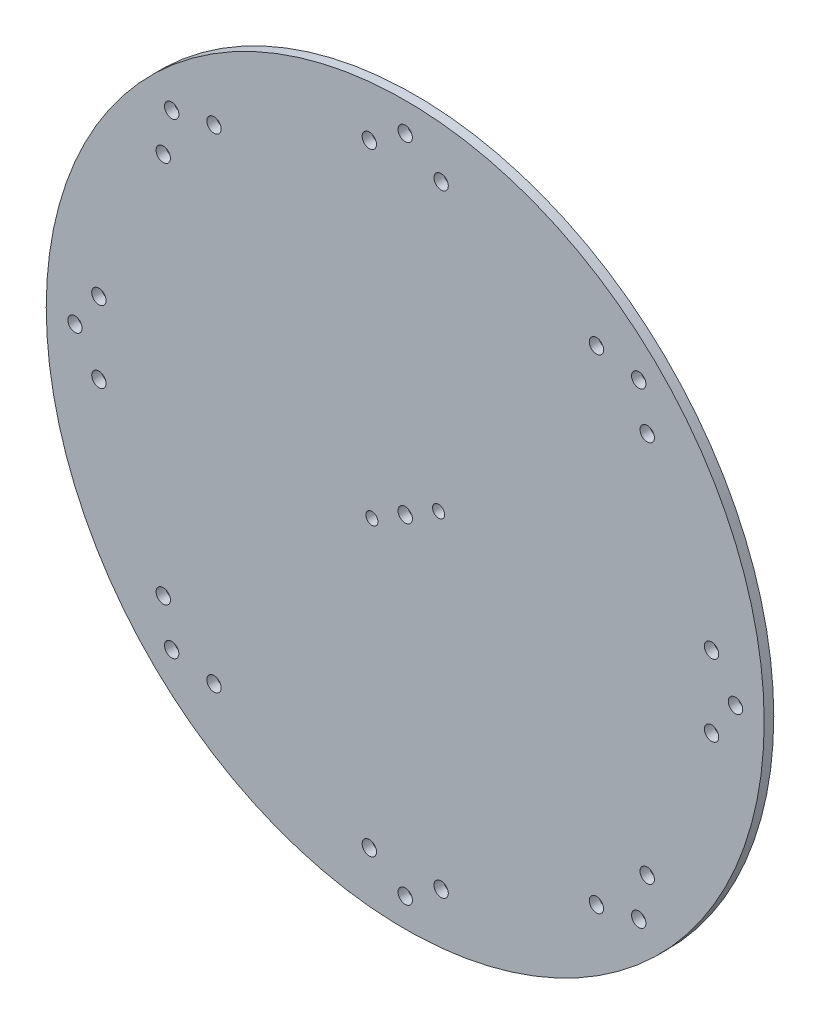
ISO-10303-21;
HEADER;
FILE_DESCRIPTION(('STEP AP214'),'2;1');
FILE_NAME('part.step','',(''),(''),'','','');
FILE_SCHEMA(('AUTOMOTIVE_DESIGN { 1 0 10303 214 1 1 1 1 }'));
ENDSEC;
DATA;
#1=APPLICATION_CONTEXT('core data for automotive mechanical design processes');
#2=APPLICATION_PROTOCOL_DEFINITION('international standard','automotive_design',2000,#1);
#3=PRODUCT_CONTEXT('',#1,'mechanical');
#4=PRODUCT('Part','Part','',(#3));
#5=PRODUCT_RELATED_PRODUCT_CATEGORY('part','',(#4));
#6=PRODUCT_DEFINITION_FORMATION('','',#4);
#7=PRODUCT_DEFINITION_CONTEXT('part definition',#1,'design');
#8=PRODUCT_DEFINITION('design','',#6,#7);
#9=PRODUCT_DEFINITION_SHAPE('','',#8);
#10=(LENGTH_UNIT() NAMED_UNIT(*) SI_UNIT(.MILLI.,.METRE.));
#11=(NAMED_UNIT(*) PLANE_ANGLE_UNIT() SI_UNIT($,.RADIAN.));
#12=(NAMED_UNIT(*) SI_UNIT($,.STERADIAN.) SOLID_ANGLE_UNIT());
#13=UNCERTAINTY_MEASURE_WITH_UNIT(LENGTH_MEASURE(1.E-05),#10,'distance_accuracy_value','');
#14=(GEOMETRIC_REPRESENTATION_CONTEXT(3) GLOBAL_UNCERTAINTY_ASSIGNED_CONTEXT((#13)) GLOBAL_UNIT_ASSIGNED_CONTEXT((#10,
#11,#12)) REPRESENTATION_CONTEXT('',''));
#15=CARTESIAN_POINT('',(0.,0.,0.));
#16=DIRECTION('',(0.,0.,1.));
#17=DIRECTION('',(1.,0.,0.));
#18=AXIS2_PLACEMENT_3D('',#15,#16,#17);
#19=CARTESIAN_POINT('',(6.90000000000001,0.,2.));
#20=DIRECTION('',(0.,0.,1.));
#21=DIRECTION('',(1.,0.,0.));
#22=AXIS2_PLACEMENT_3D('',#19,#20,#21);
#23=PLANE('',#22);
#24=CARTESIAN_POINT('',(13.8682935772488,4.12951384805443,2.));
#25=DIRECTION('',(0.,0.,1.));
#26=DIRECTION('',(1.,0.,0.));
#27=AXIS2_PLACEMENT_3D('',#24,#25,#26);
#28=CIRCLE('',#27,1.26482364092477);
#29=CARTESIAN_POINT('',(15.1331172181736,4.12951384805443,2.));
#30=VERTEX_POINT('',#29);
#31=EDGE_CURVE('E65',#30,#30,#28,.T.);
#32=ORIENTED_EDGE('',*,*,#31,.F.);
#33=EDGE_LOOP('',(#32));
#34=FACE_BOUND('',#33,.T.);
#35=CARTESIAN_POINT('',(-0.068293577248784,-4.12951384805443,2.));
#36=DIRECTION('',(0.,0.,1.));
#37=DIRECTION('',(1.,0.,0.));
#38=AXIS2_PLACEMENT_3D('',#35,#36,#37);
#39=CIRCLE('',#38,1.26482364092477);
#40=CARTESIAN_POINT('',(1.19653006367598,-4.12951384805443,2.));
#41=VERTEX_POINT('',#40);
#42=EDGE_CURVE('E71',#41,#41,#39,.T.);
#43=ORIENTED_EDGE('',*,*,#42,.F.);
#44=EDGE_LOOP('',(#43));
#45=FACE_BOUND('',#44,.T.);
#46=CARTESIAN_POINT('',(6.89999999999977,-69.,2.));
#47=DIRECTION('',(0.,0.,1.));
#48=DIRECTION('',(0.,-1.,0.));
#49=AXIS2_PLACEMENT_3D('',#46,#47,#48);
#50=CIRCLE('',#49,1.5);
#51=CARTESIAN_POINT('',(6.89999999999977,-70.5,2.));
#52=VERTEX_POINT('',#51);
#53=EDGE_CURVE('E126',#52,#52,#50,.T.);
#54=ORIENTED_EDGE('',*,*,#53,.F.);
#55=EDGE_LOOP('',(#54));
#56=FACE_BOUND('',#55,.T.);
#57=CARTESIAN_POINT('',(-43.6581348548384,-39.9515331370397,2.));
#58=DIRECTION('',(0.,0.,1.));
#59=DIRECTION('',(-0.707106781186551,-0.707106781186544,0.));
#60=AXIS2_PLACEMENT_3D('',#57,#58,#59);
#61=CIRCLE('',#60,1.5);
#62=CARTESIAN_POINT('',(-44.7187950266182,-41.0121933088195,2.));
#63=VERTEX_POINT('',#62);
#64=EDGE_CURVE('E111',#63,#63,#61,.T.);
#65=ORIENTED_EDGE('',*,*,#64,.F.);
#66=EDGE_LOOP('',(#65));
#67=FACE_BOUND('',#66,.T.);
#68=CARTESIAN_POINT('',(-33.0515331370402,-50.5581348548379,2.));
#69=DIRECTION('',(0.,0.,1.));
#70=DIRECTION('',(-0.707106781186551,-0.707106781186544,0.));
#71=AXIS2_PLACEMENT_3D('',#68,#69,#70);
#72=CIRCLE('',#71,1.50000000000001);
#73=CARTESIAN_POINT('',(-34.11219330882,-51.6187950266178,2.));
#74=VERTEX_POINT('',#73);
#75=EDGE_CURVE('E112',#74,#74,#72,.T.);
#76=ORIENTED_EDGE('',*,*,#75,.F.);
#77=EDGE_LOOP('',(#76));
#78=FACE_BOUND('',#77,.T.);
#79=CARTESIAN_POINT('',(-41.890367901872,-48.7903679018715,2.));
#80=DIRECTION('',(0.,0.,1.));
#81=DIRECTION('',(-0.707106781186551,-0.707106781186544,0.));
#82=AXIS2_PLACEMENT_3D('',#79,#80,#81);
#83=CIRCLE('',#82,1.5);
#84=CARTESIAN_POINT('',(-42.9510280736519,-49.8510280736513,2.));
#85=VERTEX_POINT('',#84);
#86=EDGE_CURVE('E118',#85,#85,#83,.T.);
#87=ORIENTED_EDGE('',*,*,#86,.F.);
#88=EDGE_LOOP('',(#87));
#89=FACE_BOUND('',#88,.T.);
#90=CARTESIAN_POINT('',(14.3999999999998,-64.,2.));
#91=DIRECTION('',(0.,0.,1.));
#92=DIRECTION('',(0.,-1.,0.));
#93=AXIS2_PLACEMENT_3D('',#90,#91,#92);
#94=CIRCLE('',#93,1.50000000000001);
#95=CARTESIAN_POINT('',(14.3999999999998,-65.5000000000001,2.));
#96=VERTEX_POINT('',#95);
#97=EDGE_CURVE('E125',#96,#96,#94,.T.);
#98=ORIENTED_EDGE('',*,*,#97,.F.);
#99=EDGE_LOOP('',(#98));
#100=FACE_BOUND('',#99,.T.);
#101=CARTESIAN_POINT('',(-0.600000000000212,-64.,2.));
#102=DIRECTION('',(0.,0.,1.));
#103=DIRECTION('',(0.,-1.,0.));
#104=AXIS2_PLACEMENT_3D('',#101,#102,#103);
#105=CIRCLE('',#104,1.5);
#106=CARTESIAN_POINT('',(-0.600000000000218,-65.5,2.));
#107=VERTEX_POINT('',#106);
#108=EDGE_CURVE('E150',#107,#107,#105,.T.);
#109=ORIENTED_EDGE('',*,*,#108,.F.);
#110=EDGE_LOOP('',(#109));
#111=FACE_BOUND('',#110,.T.);
#112=CARTESIAN_POINT('',(55.6903679018717,-48.7903679018719,2.));
#113=DIRECTION('',(0.,0.,1.));
#114=DIRECTION('',(0.707106781186546,-0.707106781186549,0.));
#115=AXIS2_PLACEMENT_3D('',#112,#113,#114);
#116=CIRCLE('',#115,1.5);
#117=CARTESIAN_POINT('',(56.7510280736515,-49.8510280736517,2.));
#118=VERTEX_POINT('',#117);
#119=EDGE_CURVE('E144',#118,#118,#116,.T.);
#120=ORIENTED_EDGE('',*,*,#119,.F.);
#121=EDGE_LOOP('',(#120));
#122=FACE_BOUND('',#121,.T.);
#123=CARTESIAN_POINT('',(57.4581348548381,-39.95153313704,2.));
#124=DIRECTION('',(0.,0.,1.));
#125=DIRECTION('',(0.707106781186546,-0.707106781186549,0.));
#126=AXIS2_PLACEMENT_3D('',#123,#124,#125);
#127=CIRCLE('',#126,1.50000000000001);
#128=CARTESIAN_POINT('',(58.5187950266179,-41.0121933088199,2.));
#129=VERTEX_POINT('',#128);
#130=EDGE_CURVE('E138',#129,#129,#127,.T.);
#131=ORIENTED_EDGE('',*,*,#130,.F.);
#132=EDGE_LOOP('',(#131));
#133=FACE_BOUND('',#132,.T.);
#134=CARTESIAN_POINT('',(-0.599999999999322,64.0000000000001,2.));
#135=DIRECTION('',(0.,0.,1.));
#136=DIRECTION('',(0.,1.,0.));
#137=AXIS2_PLACEMENT_3D('',#134,#135,#136);
#138=CIRCLE('',#137,1.50000000000001);
#139=CARTESIAN_POINT('',(-0.599999999999307,65.5000000000001,2.));
#140=VERTEX_POINT('',#139);
#141=EDGE_CURVE('E99',#140,#140,#138,.T.);
#142=ORIENTED_EDGE('',*,*,#141,.F.);
#143=EDGE_LOOP('',(#142));
#144=FACE_BOUND('',#143,.T.);
#145=CARTESIAN_POINT('',(14.4000000000007,63.9999999999999,2.));
#146=DIRECTION('',(0.,0.,1.));
#147=DIRECTION('',(0.,1.,0.));
#148=AXIS2_PLACEMENT_3D('',#145,#146,#147);
#149=CIRCLE('',#148,1.5);
#150=CARTESIAN_POINT('',(14.4000000000007,65.4999999999999,2.));
#151=VERTEX_POINT('',#150);
#152=EDGE_CURVE('E174',#151,#151,#149,.T.);
#153=ORIENTED_EDGE('',*,*,#152,.F.);
#154=EDGE_LOOP('',(#153));
#155=FACE_BOUND('',#154,.T.);
#156=CARTESIAN_POINT('',(-41.8903679018714,48.7903679018722,2.));
#157=DIRECTION('',(0.,0.,1.));
#158=DIRECTION('',(-0.707106781186541,0.707106781186554,0.));
#159=AXIS2_PLACEMENT_3D('',#156,#157,#158);
#160=CIRCLE('',#159,1.5);
#161=CARTESIAN_POINT('',(-42.9510280736512,49.851028073652,2.));
#162=VERTEX_POINT('',#161);
#163=EDGE_CURVE('E168',#162,#162,#160,.T.);
#164=ORIENTED_EDGE('',*,*,#163,.F.);
#165=EDGE_LOOP('',(#164));
#166=FACE_BOUND('',#165,.T.);
#167=CARTESIAN_POINT('',(-43.6581348548378,39.9515331370404,2.));
#168=DIRECTION('',(0.,0.,1.));
#169=DIRECTION('',(-0.707106781186541,0.707106781186554,0.));
#170=AXIS2_PLACEMENT_3D('',#167,#168,#169);
#171=CIRCLE('',#170,1.50000000000001);
#172=CARTESIAN_POINT('',(-44.7187950266176,41.0121933088202,2.));
#173=VERTEX_POINT('',#172);
#174=EDGE_CURVE('E162',#173,#173,#171,.T.);
#175=ORIENTED_EDGE('',*,*,#174,.F.);
#176=EDGE_LOOP('',(#175));
#177=FACE_BOUND('',#176,.T.);
#178=CARTESIAN_POINT('',(-57.1,7.49999999999999,2.));
#179=DIRECTION('',(0.,0.,1.));
#180=DIRECTION('',(-1.,0.,0.));
#181=AXIS2_PLACEMENT_3D('',#178,#179,#180);
#182=CIRCLE('',#181,1.5);
#183=CARTESIAN_POINT('',(-58.6,7.49999999999999,2.));
#184=VERTEX_POINT('',#183);
#185=EDGE_CURVE('E196',#184,#184,#182,.T.);
#186=ORIENTED_EDGE('',*,*,#185,.F.);
#187=EDGE_LOOP('',(#186));
#188=FACE_BOUND('',#187,.T.);
#189=CARTESIAN_POINT('',(-57.1,-7.50000000000001,2.));
#190=DIRECTION('',(0.,0.,1.));
#191=DIRECTION('',(-1.,0.,0.));
#192=AXIS2_PLACEMENT_3D('',#189,#190,#191);
#193=CIRCLE('',#192,1.50000000000001);
#194=CARTESIAN_POINT('',(-58.6,-7.50000000000001,2.));
#195=VERTEX_POINT('',#194);
#196=EDGE_CURVE('E185',#195,#195,#193,.T.);
#197=ORIENTED_EDGE('',*,*,#196,.F.);
#198=EDGE_LOOP('',(#197));
#199=FACE_BOUND('',#198,.T.);
#200=CARTESIAN_POINT('',(-62.1,0.,2.));
#201=DIRECTION('',(0.,0.,1.));
#202=DIRECTION('',(-1.,0.,0.));
#203=AXIS2_PLACEMENT_3D('',#200,#201,#202);
#204=CIRCLE('',#203,1.5);
#205=CARTESIAN_POINT('',(-63.6,0.,2.));
#206=VERTEX_POINT('',#205);
#207=EDGE_CURVE('E186',#206,#206,#204,.T.);
#208=ORIENTED_EDGE('',*,*,#207,.F.);
#209=EDGE_LOOP('',(#208));
#210=FACE_BOUND('',#209,.T.);
#211=CARTESIAN_POINT('',(-33.0515331370395,50.5581348548385,2.));
#212=DIRECTION('',(0.,0.,1.));
#213=DIRECTION('',(-0.707106781186541,0.707106781186554,0.));
#214=AXIS2_PLACEMENT_3D('',#211,#212,#213);
#215=CIRCLE('',#214,1.5);
#216=CARTESIAN_POINT('',(-34.1121933088193,51.6187950266183,2.));
#217=VERTEX_POINT('',#216);
#218=EDGE_CURVE('E161',#217,#217,#215,.T.);
#219=ORIENTED_EDGE('',*,*,#218,.F.);
#220=EDGE_LOOP('',(#219));
#221=FACE_BOUND('',#220,.T.);
#222=CARTESIAN_POINT('',(55.6903679018724,48.7903679018712,2.));
#223=DIRECTION('',(0.,0.,1.));
#224=DIRECTION('',(0.707106781186556,0.707106781186539,0.));
#225=AXIS2_PLACEMENT_3D('',#222,#223,#224);
#226=CIRCLE('',#225,1.5);
#227=CARTESIAN_POINT('',(56.7510280736522,49.851028073651,2.));
#228=VERTEX_POINT('',#227);
#229=EDGE_CURVE('E83',#228,#228,#226,.T.);
#230=ORIENTED_EDGE('',*,*,#229,.F.);
#231=EDGE_LOOP('',(#230));
#232=FACE_BOUND('',#231,.T.);
#233=CARTESIAN_POINT('',(46.8515331370406,50.5581348548377,2.));
#234=DIRECTION('',(0.,0.,1.));
#235=DIRECTION('',(0.707106781186556,0.707106781186539,0.));
#236=AXIS2_PLACEMENT_3D('',#233,#234,#235);
#237=CIRCLE('',#236,1.50000000000001);
#238=CARTESIAN_POINT('',(47.9121933088204,51.6187950266175,2.));
#239=VERTEX_POINT('',#238);
#240=EDGE_CURVE('E88',#239,#239,#237,.T.);
#241=ORIENTED_EDGE('',*,*,#240,.F.);
#242=EDGE_LOOP('',(#241));
#243=FACE_BOUND('',#242,.T.);
#244=CARTESIAN_POINT('',(57.4581348548387,39.9515331370393,2.));
#245=DIRECTION('',(0.,0.,1.));
#246=DIRECTION('',(0.707106781186556,0.707106781186539,0.));
#247=AXIS2_PLACEMENT_3D('',#244,#245,#246);
#248=CIRCLE('',#247,1.5);
#249=CARTESIAN_POINT('',(58.5187950266185,41.0121933088191,2.));
#250=VERTEX_POINT('',#249);
#251=EDGE_CURVE('E87',#250,#250,#248,.T.);
#252=ORIENTED_EDGE('',*,*,#251,.F.);
#253=EDGE_LOOP('',(#252));
#254=FACE_BOUND('',#253,.T.);
#255=CARTESIAN_POINT('',(6.90000000000073,69.,2.));
#256=DIRECTION('',(0.,0.,1.));
#257=DIRECTION('',(0.,1.,0.));
#258=AXIS2_PLACEMENT_3D('',#255,#256,#257);
#259=CIRCLE('',#258,1.5);
#260=CARTESIAN_POINT('',(6.90000000000074,70.5,2.));
#261=VERTEX_POINT('',#260);
#262=EDGE_CURVE('E100',#261,#261,#259,.T.);
#263=ORIENTED_EDGE('',*,*,#262,.F.);
#264=EDGE_LOOP('',(#263));
#265=FACE_BOUND('',#264,.T.);
#266=CARTESIAN_POINT('',(46.8515331370399,-50.5581348548382,2.));
#267=DIRECTION('',(0.,0.,1.));
#268=DIRECTION('',(0.707106781186546,-0.707106781186549,0.));
#269=AXIS2_PLACEMENT_3D('',#266,#267,#268);
#270=CIRCLE('',#269,1.5);
#271=CARTESIAN_POINT('',(47.9121933088197,-51.6187950266181,2.));
#272=VERTEX_POINT('',#271);
#273=EDGE_CURVE('E137',#272,#272,#270,.T.);
#274=ORIENTED_EDGE('',*,*,#273,.F.);
#275=EDGE_LOOP('',(#274));
#276=FACE_BOUND('',#275,.T.);
#277=CARTESIAN_POINT('',(70.9,-7.5,2.));
#278=DIRECTION('',(0.,0.,1.));
#279=DIRECTION('',(1.,0.,0.));
#280=AXIS2_PLACEMENT_3D('',#277,#278,#279);
#281=CIRCLE('',#280,1.5);
#282=CARTESIAN_POINT('',(72.4,-7.5,2.));
#283=VERTEX_POINT('',#282);
#284=EDGE_CURVE('E211',#283,#283,#281,.T.);
#285=ORIENTED_EDGE('',*,*,#284,.F.);
#286=EDGE_LOOP('',(#285));
#287=FACE_BOUND('',#286,.T.);
#288=CARTESIAN_POINT('',(70.9,7.5,2.));
#289=DIRECTION('',(0.,0.,1.));
#290=DIRECTION('',(1.,0.,0.));
#291=AXIS2_PLACEMENT_3D('',#288,#289,#290);
#292=CIRCLE('',#291,1.50000000000001);
#293=CARTESIAN_POINT('',(72.4,7.5,2.));
#294=VERTEX_POINT('',#293);
#295=EDGE_CURVE('E217',#294,#294,#292,.T.);
#296=ORIENTED_EDGE('',*,*,#295,.F.);
#297=EDGE_LOOP('',(#296));
#298=FACE_BOUND('',#297,.T.);
#299=CARTESIAN_POINT('',(75.9,0.,2.));
#300=DIRECTION('',(0.,0.,1.));
#301=DIRECTION('',(1.,0.,0.));
#302=AXIS2_PLACEMENT_3D('',#299,#300,#301);
#303=CIRCLE('',#302,1.5);
#304=CARTESIAN_POINT('',(77.4,0.,2.));
#305=VERTEX_POINT('',#304);
#306=EDGE_CURVE('E61',#305,#305,#303,.T.);
#307=ORIENTED_EDGE('',*,*,#306,.F.);
#308=EDGE_LOOP('',(#307));
#309=FACE_BOUND('',#308,.T.);
#310=CARTESIAN_POINT('',(6.90000000000001,0.,2.));
#311=DIRECTION('',(0.,0.,1.));
#312=DIRECTION('',(1.,0.,0.));
#313=AXIS2_PLACEMENT_3D('',#310,#311,#312);
#314=CIRCLE('',#313,75.);
#315=CARTESIAN_POINT('',(81.9,0.,2.));
#316=VERTEX_POINT('',#315);
#317=EDGE_CURVE('E12',#316,#316,#314,.T.);
#318=ORIENTED_EDGE('',*,*,#317,.T.);
#319=EDGE_LOOP('',(#318));
#320=FACE_BOUND('',#319,.T.);
#321=CARTESIAN_POINT('',(6.90000000000001,0.,2.));
#322=DIRECTION('',(0.,0.,1.));
#323=DIRECTION('',(1.,0.,0.));
#324=AXIS2_PLACEMENT_3D('',#321,#322,#323);
#325=CIRCLE('',#324,1.5);
#326=CARTESIAN_POINT('',(5.40000000000001,0.,2.));
#327=VERTEX_POINT('',#326);
#328=EDGE_CURVE('E80',#327,#327,#325,.F.);
#329=ORIENTED_EDGE('',*,*,#328,.T.);
#330=EDGE_LOOP('',(#329));
#331=FACE_BOUND('',#330,.T.);
#332=ADVANCED_FACE('F45',(#34,#45,#56,#67,#78,#89,#100,#111,#122,#133,#144,#155,#166,#177,#188,
#199,#210,#221,#232,#243,#254,#265,#276,#287,#298,#309,#320,#331),#23,.T.);
#333=CARTESIAN_POINT('',(6.90000000000001,0.,0.));
#334=DIRECTION('',(0.,0.,1.));
#335=DIRECTION('',(1.,0.,0.));
#336=AXIS2_PLACEMENT_3D('',#333,#334,#335);
#337=PLANE('',#336);
#338=CARTESIAN_POINT('',(13.8682935772488,4.12951384805443,0.));
#339=DIRECTION('',(0.,0.,1.));
#340=DIRECTION('',(1.,0.,0.));
#341=AXIS2_PLACEMENT_3D('',#338,#339,#340);
#342=CIRCLE('',#341,1.26482364092477);
#343=CARTESIAN_POINT('',(15.1331172181736,4.12951384805443,0.));
#344=VERTEX_POINT('',#343);
#345=EDGE_CURVE('E49',#344,#344,#342,.T.);
#346=ORIENTED_EDGE('',*,*,#345,.T.);
#347=EDGE_LOOP('',(#346));
#348=FACE_BOUND('',#347,.T.);
#349=CARTESIAN_POINT('',(-0.068293577248784,-4.12951384805443,0.));
#350=DIRECTION('',(0.,0.,1.));
#351=DIRECTION('',(1.,0.,0.));
#352=AXIS2_PLACEMENT_3D('',#349,#350,#351);
#353=CIRCLE('',#352,1.26482364092477);
#354=CARTESIAN_POINT('',(1.19653006367598,-4.12951384805443,0.));
#355=VERTEX_POINT('',#354);
#356=EDGE_CURVE('E63',#355,#355,#353,.T.);
#357=ORIENTED_EDGE('',*,*,#356,.T.);
#358=EDGE_LOOP('',(#357));
#359=FACE_BOUND('',#358,.T.);
#360=CARTESIAN_POINT('',(6.89999999999977,-69.,0.));
#361=DIRECTION('',(0.,0.,1.));
#362=DIRECTION('',(0.,-1.,0.));
#363=AXIS2_PLACEMENT_3D('',#360,#361,#362);
#364=CIRCLE('',#363,1.5);
#365=CARTESIAN_POINT('',(6.89999999999977,-70.5,0.));
#366=VERTEX_POINT('',#365);
#367=EDGE_CURVE('E122',#366,#366,#364,.T.);
#368=ORIENTED_EDGE('',*,*,#367,.T.);
#369=EDGE_LOOP('',(#368));
#370=FACE_BOUND('',#369,.T.);
#371=CARTESIAN_POINT('',(-43.6581348548384,-39.9515331370397,0.));
#372=DIRECTION('',(0.,0.,1.));
#373=DIRECTION('',(-0.707106781186551,-0.707106781186544,0.));
#374=AXIS2_PLACEMENT_3D('',#371,#372,#373);
#375=CIRCLE('',#374,1.5);
#376=CARTESIAN_POINT('',(-44.7187950266182,-41.0121933088195,0.));
#377=VERTEX_POINT('',#376);
#378=EDGE_CURVE('E129',#377,#377,#375,.T.);
#379=ORIENTED_EDGE('',*,*,#378,.T.);
#380=EDGE_LOOP('',(#379));
#381=FACE_BOUND('',#380,.T.);
#382=CARTESIAN_POINT('',(-33.0515331370402,-50.5581348548379,0.));
#383=DIRECTION('',(0.,0.,1.));
#384=DIRECTION('',(-0.707106781186551,-0.707106781186544,0.));
#385=AXIS2_PLACEMENT_3D('',#382,#383,#384);
#386=CIRCLE('',#385,1.50000000000001);
#387=CARTESIAN_POINT('',(-34.11219330882,-51.6187950266178,0.));
#388=VERTEX_POINT('',#387);
#389=EDGE_CURVE('E108',#388,#388,#386,.T.);
#390=ORIENTED_EDGE('',*,*,#389,.T.);
#391=EDGE_LOOP('',(#390));
#392=FACE_BOUND('',#391,.T.);
#393=CARTESIAN_POINT('',(-41.890367901872,-48.7903679018715,0.));
#394=DIRECTION('',(0.,0.,1.));
#395=DIRECTION('',(-0.707106781186551,-0.707106781186544,0.));
#396=AXIS2_PLACEMENT_3D('',#393,#394,#395);
#397=CIRCLE('',#396,1.5);
#398=CARTESIAN_POINT('',(-42.9510280736519,-49.8510280736513,0.));
#399=VERTEX_POINT('',#398);
#400=EDGE_CURVE('E115',#399,#399,#397,.T.);
#401=ORIENTED_EDGE('',*,*,#400,.T.);
#402=EDGE_LOOP('',(#401));
#403=FACE_BOUND('',#402,.T.);
#404=CARTESIAN_POINT('',(14.3999999999998,-64.,0.));
#405=DIRECTION('',(0.,0.,1.));
#406=DIRECTION('',(0.,-1.,0.));
#407=AXIS2_PLACEMENT_3D('',#404,#405,#406);
#408=CIRCLE('',#407,1.50000000000001);
#409=CARTESIAN_POINT('',(14.3999999999998,-65.5000000000001,0.));
#410=VERTEX_POINT('',#409);
#411=EDGE_CURVE('E153',#410,#410,#408,.T.);
#412=ORIENTED_EDGE('',*,*,#411,.T.);
#413=EDGE_LOOP('',(#412));
#414=FACE_BOUND('',#413,.T.);
#415=CARTESIAN_POINT('',(-0.600000000000212,-64.,0.));
#416=DIRECTION('',(0.,0.,1.));
#417=DIRECTION('',(0.,-1.,0.));
#418=AXIS2_PLACEMENT_3D('',#415,#416,#417);
#419=CIRCLE('',#418,1.5);
#420=CARTESIAN_POINT('',(-0.600000000000218,-65.5,0.));
#421=VERTEX_POINT('',#420);
#422=EDGE_CURVE('E147',#421,#421,#419,.T.);
#423=ORIENTED_EDGE('',*,*,#422,.T.);
#424=EDGE_LOOP('',(#423));
#425=FACE_BOUND('',#424,.T.);
#426=CARTESIAN_POINT('',(55.6903679018717,-48.7903679018719,0.));
#427=DIRECTION('',(0.,0.,1.));
#428=DIRECTION('',(0.707106781186546,-0.707106781186549,0.));
#429=AXIS2_PLACEMENT_3D('',#426,#427,#428);
#430=CIRCLE('',#429,1.5);
#431=CARTESIAN_POINT('',(56.7510280736515,-49.8510280736517,0.));
#432=VERTEX_POINT('',#431);
#433=EDGE_CURVE('E141',#432,#432,#430,.T.);
#434=ORIENTED_EDGE('',*,*,#433,.T.);
#435=EDGE_LOOP('',(#434));
#436=FACE_BOUND('',#435,.T.);
#437=CARTESIAN_POINT('',(57.4581348548381,-39.95153313704,0.));
#438=DIRECTION('',(0.,0.,1.));
#439=DIRECTION('',(0.707106781186546,-0.707106781186549,0.));
#440=AXIS2_PLACEMENT_3D('',#437,#438,#439);
#441=CIRCLE('',#440,1.50000000000001);
#442=CARTESIAN_POINT('',(58.5187950266179,-41.0121933088199,0.));
#443=VERTEX_POINT('',#442);
#444=EDGE_CURVE('E134',#443,#443,#441,.T.);
#445=ORIENTED_EDGE('',*,*,#444,.T.);
#446=EDGE_LOOP('',(#445));
#447=FACE_BOUND('',#446,.T.);
#448=CARTESIAN_POINT('',(-0.599999999999322,64.0000000000001,0.));
#449=DIRECTION('',(0.,0.,1.));
#450=DIRECTION('',(0.,1.,0.));
#451=AXIS2_PLACEMENT_3D('',#448,#449,#450);
#452=CIRCLE('',#451,1.50000000000001);
#453=CARTESIAN_POINT('',(-0.599999999999307,65.5000000000001,0.));
#454=VERTEX_POINT('',#453);
#455=EDGE_CURVE('E177',#454,#454,#452,.T.);
#456=ORIENTED_EDGE('',*,*,#455,.T.);
#457=EDGE_LOOP('',(#456));
#458=FACE_BOUND('',#457,.T.);
#459=CARTESIAN_POINT('',(14.4000000000007,63.9999999999999,0.));
#460=DIRECTION('',(0.,0.,1.));
#461=DIRECTION('',(0.,1.,0.));
#462=AXIS2_PLACEMENT_3D('',#459,#460,#461);
#463=CIRCLE('',#462,1.5);
#464=CARTESIAN_POINT('',(14.4000000000007,65.4999999999999,0.));
#465=VERTEX_POINT('',#464);
#466=EDGE_CURVE('E171',#465,#465,#463,.T.);
#467=ORIENTED_EDGE('',*,*,#466,.T.);
#468=EDGE_LOOP('',(#467));
#469=FACE_BOUND('',#468,.T.);
#470=CARTESIAN_POINT('',(-41.8903679018714,48.7903679018722,0.));
#471=DIRECTION('',(0.,0.,1.));
#472=DIRECTION('',(-0.707106781186541,0.707106781186554,0.));
#473=AXIS2_PLACEMENT_3D('',#470,#471,#472);
#474=CIRCLE('',#473,1.5);
#475=CARTESIAN_POINT('',(-42.9510280736512,49.851028073652,0.));
#476=VERTEX_POINT('',#475);
#477=EDGE_CURVE('E165',#476,#476,#474,.T.);
#478=ORIENTED_EDGE('',*,*,#477,.T.);
#479=EDGE_LOOP('',(#478));
#480=FACE_BOUND('',#479,.T.);
#481=CARTESIAN_POINT('',(-43.6581348548378,39.9515331370404,0.));
#482=DIRECTION('',(0.,0.,1.));
#483=DIRECTION('',(-0.707106781186541,0.707106781186554,0.));
#484=AXIS2_PLACEMENT_3D('',#481,#482,#483);
#485=CIRCLE('',#484,1.50000000000001);
#486=CARTESIAN_POINT('',(-44.7187950266176,41.0121933088202,0.));
#487=VERTEX_POINT('',#486);
#488=EDGE_CURVE('E158',#487,#487,#485,.T.);
#489=ORIENTED_EDGE('',*,*,#488,.T.);
#490=EDGE_LOOP('',(#489));
#491=FACE_BOUND('',#490,.T.);
#492=CARTESIAN_POINT('',(-57.1,7.49999999999999,0.));
#493=DIRECTION('',(0.,0.,1.));
#494=DIRECTION('',(-1.,0.,0.));
#495=AXIS2_PLACEMENT_3D('',#492,#493,#494);
#496=CIRCLE('',#495,1.5);
#497=CARTESIAN_POINT('',(-58.6,7.49999999999999,0.));
#498=VERTEX_POINT('',#497);
#499=EDGE_CURVE('E121',#498,#498,#496,.T.);
#500=ORIENTED_EDGE('',*,*,#499,.T.);
#501=EDGE_LOOP('',(#500));
#502=FACE_BOUND('',#501,.T.);
#503=CARTESIAN_POINT('',(-57.1,-7.50000000000001,0.));
#504=DIRECTION('',(0.,0.,1.));
#505=DIRECTION('',(-1.,0.,0.));
#506=AXIS2_PLACEMENT_3D('',#503,#504,#505);
#507=CIRCLE('',#506,1.50000000000001);
#508=CARTESIAN_POINT('',(-58.6,-7.50000000000001,0.));
#509=VERTEX_POINT('',#508);
#510=EDGE_CURVE('E199',#509,#509,#507,.T.);
#511=ORIENTED_EDGE('',*,*,#510,.T.);
#512=EDGE_LOOP('',(#511));
#513=FACE_BOUND('',#512,.T.);
#514=CARTESIAN_POINT('',(-62.1,0.,0.));
#515=DIRECTION('',(0.,0.,1.));
#516=DIRECTION('',(-1.,0.,0.));
#517=AXIS2_PLACEMENT_3D('',#514,#515,#516);
#518=CIRCLE('',#517,1.5);
#519=CARTESIAN_POINT('',(-63.6,0.,0.));
#520=VERTEX_POINT('',#519);
#521=EDGE_CURVE('E182',#520,#520,#518,.T.);
#522=ORIENTED_EDGE('',*,*,#521,.T.);
#523=EDGE_LOOP('',(#522));
#524=FACE_BOUND('',#523,.T.);
#525=CARTESIAN_POINT('',(-33.0515331370395,50.5581348548385,0.));
#526=DIRECTION('',(0.,0.,1.));
#527=DIRECTION('',(-0.707106781186541,0.707106781186554,0.));
#528=AXIS2_PLACEMENT_3D('',#525,#526,#527);
#529=CIRCLE('',#528,1.5);
#530=CARTESIAN_POINT('',(-34.1121933088193,51.6187950266183,0.));
#531=VERTEX_POINT('',#530);
#532=EDGE_CURVE('E189',#531,#531,#529,.T.);
#533=ORIENTED_EDGE('',*,*,#532,.T.);
#534=EDGE_LOOP('',(#533));
#535=FACE_BOUND('',#534,.T.);
#536=CARTESIAN_POINT('',(55.6903679018724,48.7903679018712,0.));
#537=DIRECTION('',(0.,0.,1.));
#538=DIRECTION('',(0.707106781186556,0.707106781186539,0.));
#539=AXIS2_PLACEMENT_3D('',#536,#537,#538);
#540=CIRCLE('',#539,1.5);
#541=CARTESIAN_POINT('',(56.7510280736522,49.851028073651,0.));
#542=VERTEX_POINT('',#541);
#543=EDGE_CURVE('E91',#542,#542,#540,.T.);
#544=ORIENTED_EDGE('',*,*,#543,.T.);
#545=EDGE_LOOP('',(#544));
#546=FACE_BOUND('',#545,.T.);
#547=CARTESIAN_POINT('',(46.8515331370406,50.5581348548377,0.));
#548=DIRECTION('',(0.,0.,1.));
#549=DIRECTION('',(0.707106781186556,0.707106781186539,0.));
#550=AXIS2_PLACEMENT_3D('',#547,#548,#549);
#551=CIRCLE('',#550,1.50000000000001);
#552=CARTESIAN_POINT('',(47.9121933088204,51.6187950266175,0.));
#553=VERTEX_POINT('',#552);
#554=EDGE_CURVE('E84',#553,#553,#551,.T.);
#555=ORIENTED_EDGE('',*,*,#554,.T.);
#556=EDGE_LOOP('',(#555));
#557=FACE_BOUND('',#556,.T.);
#558=CARTESIAN_POINT('',(57.4581348548387,39.9515331370393,0.));
#559=DIRECTION('',(0.,0.,1.));
#560=DIRECTION('',(0.707106781186556,0.707106781186539,0.));
#561=AXIS2_PLACEMENT_3D('',#558,#559,#560);
#562=CIRCLE('',#561,1.5);
#563=CARTESIAN_POINT('',(58.5187950266185,41.0121933088191,0.));
#564=VERTEX_POINT('',#563);
#565=EDGE_CURVE('E103',#564,#564,#562,.T.);
#566=ORIENTED_EDGE('',*,*,#565,.T.);
#567=EDGE_LOOP('',(#566));
#568=FACE_BOUND('',#567,.T.);
#569=CARTESIAN_POINT('',(6.90000000000073,69.,0.));
#570=DIRECTION('',(0.,0.,1.));
#571=DIRECTION('',(0.,1.,0.));
#572=AXIS2_PLACEMENT_3D('',#569,#570,#571);
#573=CIRCLE('',#572,1.5);
#574=CARTESIAN_POINT('',(6.90000000000074,70.5,0.));
#575=VERTEX_POINT('',#574);
#576=EDGE_CURVE('E96',#575,#575,#573,.T.);
#577=ORIENTED_EDGE('',*,*,#576,.T.);
#578=EDGE_LOOP('',(#577));
#579=FACE_BOUND('',#578,.T.);
#580=CARTESIAN_POINT('',(46.8515331370399,-50.5581348548382,0.));
#581=DIRECTION('',(0.,0.,1.));
#582=DIRECTION('',(0.707106781186546,-0.707106781186549,0.));
#583=AXIS2_PLACEMENT_3D('',#580,#581,#582);
#584=CIRCLE('',#583,1.5);
#585=CARTESIAN_POINT('',(47.9121933088197,-51.6187950266181,0.));
#586=VERTEX_POINT('',#585);
#587=EDGE_CURVE('E204',#586,#586,#584,.T.);
#588=ORIENTED_EDGE('',*,*,#587,.T.);
#589=EDGE_LOOP('',(#588));
#590=FACE_BOUND('',#589,.T.);
#591=CARTESIAN_POINT('',(70.9,-7.5,0.));
#592=DIRECTION('',(0.,0.,1.));
#593=DIRECTION('',(1.,0.,0.));
#594=AXIS2_PLACEMENT_3D('',#591,#592,#593);
#595=CIRCLE('',#594,1.5);
#596=CARTESIAN_POINT('',(72.4,-7.5,0.));
#597=VERTEX_POINT('',#596);
#598=EDGE_CURVE('E58',#597,#597,#595,.T.);
#599=ORIENTED_EDGE('',*,*,#598,.T.);
#600=EDGE_LOOP('',(#599));
#601=FACE_BOUND('',#600,.T.);
#602=CARTESIAN_POINT('',(70.9,7.5,0.));
#603=DIRECTION('',(0.,0.,1.));
#604=DIRECTION('',(1.,0.,0.));
#605=AXIS2_PLACEMENT_3D('',#602,#603,#604);
#606=CIRCLE('',#605,1.50000000000001);
#607=CARTESIAN_POINT('',(72.4,7.5,0.));
#608=VERTEX_POINT('',#607);
#609=EDGE_CURVE('E214',#608,#608,#606,.T.);
#610=ORIENTED_EDGE('',*,*,#609,.T.);
#611=EDGE_LOOP('',(#610));
#612=FACE_BOUND('',#611,.T.);
#613=CARTESIAN_POINT('',(75.9,0.,0.));
#614=DIRECTION('',(0.,0.,1.));
#615=DIRECTION('',(1.,0.,0.));
#616=AXIS2_PLACEMENT_3D('',#613,#614,#615);
#617=CIRCLE('',#616,1.5);
#618=CARTESIAN_POINT('',(77.4,0.,0.));
#619=VERTEX_POINT('',#618);
#620=EDGE_CURVE('E219',#619,#619,#617,.T.);
#621=ORIENTED_EDGE('',*,*,#620,.T.);
#622=EDGE_LOOP('',(#621));
#623=FACE_BOUND('',#622,.T.);
#624=CARTESIAN_POINT('',(6.90000000000001,0.,0.));
#625=DIRECTION('',(0.,0.,1.));
#626=DIRECTION('',(1.,0.,0.));
#627=AXIS2_PLACEMENT_3D('',#624,#625,#626);
#628=CIRCLE('',#627,75.);
#629=CARTESIAN_POINT('',(81.9,0.,0.));
#630=VERTEX_POINT('',#629);
#631=EDGE_CURVE('E53',#630,#630,#628,.T.);
#632=ORIENTED_EDGE('',*,*,#631,.F.);
#633=EDGE_LOOP('',(#632));
#634=FACE_BOUND('',#633,.T.);
#635=CARTESIAN_POINT('',(6.90000000000001,0.,0.));
#636=DIRECTION('',(0.,0.,-1.));
#637=DIRECTION('',(-1.,0.,0.));
#638=AXIS2_PLACEMENT_3D('',#635,#636,#637);
#639=CIRCLE('',#638,1.5);
#640=CARTESIAN_POINT('',(5.40000000000001,0.,0.));
#641=VERTEX_POINT('',#640);
#642=EDGE_CURVE('E69',#641,#641,#639,.T.);
#643=ORIENTED_EDGE('',*,*,#642,.F.);
#644=EDGE_LOOP('',(#643));
#645=FACE_BOUND('',#644,.T.);
#646=ADVANCED_FACE('F229',(#348,#359,#370,#381,#392,#403,#414,#425,#436,#447,#458,#469,#480,
#491,#502,#513,#524,#535,#546,#557,#568,#579,#590,#601,#612,#623,#634,#645),#337,.F.);
#647=CARTESIAN_POINT('',(6.90000000000001,0.,2.));
#648=DIRECTION('',(0.,0.,-1.));
#649=DIRECTION('',(-1.,0.,0.));
#650=AXIS2_PLACEMENT_3D('',#647,#648,#649);
#651=CYLINDRICAL_SURFACE('',#650,75.);
#652=ORIENTED_EDGE('',*,*,#317,.F.);
#653=EDGE_LOOP('',(#652));
#654=FACE_BOUND('',#653,.T.);
#655=ORIENTED_EDGE('',*,*,#631,.T.);
#656=EDGE_LOOP('',(#655));
#657=FACE_BOUND('',#656,.T.);
#658=ADVANCED_FACE('F47',(#654,#657),#651,.T.);
#659=CARTESIAN_POINT('',(75.9,0.,0.));
#660=DIRECTION('',(0.,0.,1.));
#661=DIRECTION('',(1.,0.,0.));
#662=AXIS2_PLACEMENT_3D('',#659,#660,#661);
#663=CYLINDRICAL_SURFACE('',#662,1.5);
#664=ORIENTED_EDGE('',*,*,#620,.F.);
#665=EDGE_LOOP('',(#664));
#666=FACE_BOUND('',#665,.T.);
#667=ORIENTED_EDGE('',*,*,#306,.T.);
#668=EDGE_LOOP('',(#667));
#669=FACE_BOUND('',#668,.T.);
#670=ADVANCED_FACE('F226',(#666,#669),#663,.F.);
#671=CARTESIAN_POINT('',(70.9,7.5,0.));
#672=DIRECTION('',(0.,0.,1.));
#673=DIRECTION('',(1.,0.,0.));
#674=AXIS2_PLACEMENT_3D('',#671,#672,#673);
#675=CYLINDRICAL_SURFACE('',#674,1.50000000000001);
#676=ORIENTED_EDGE('',*,*,#609,.F.);
#677=EDGE_LOOP('',(#676));
#678=FACE_BOUND('',#677,.T.);
#679=ORIENTED_EDGE('',*,*,#295,.T.);
#680=EDGE_LOOP('',(#679));
#681=FACE_BOUND('',#680,.T.);
#682=ADVANCED_FACE('F335',(#678,#681),#675,.F.);
#683=CARTESIAN_POINT('',(70.9,-7.5,0.));
#684=DIRECTION('',(0.,0.,1.));
#685=DIRECTION('',(1.,0.,0.));
#686=AXIS2_PLACEMENT_3D('',#683,#684,#685);
#687=CYLINDRICAL_SURFACE('',#686,1.5);
#688=ORIENTED_EDGE('',*,*,#598,.F.);
#689=EDGE_LOOP('',(#688));
#690=FACE_BOUND('',#689,.T.);
#691=ORIENTED_EDGE('',*,*,#284,.T.);
#692=EDGE_LOOP('',(#691));
#693=FACE_BOUND('',#692,.T.);
#694=ADVANCED_FACE('F331',(#690,#693),#687,.F.);
#695=CARTESIAN_POINT('',(46.8515331370399,-50.5581348548382,0.));
#696=DIRECTION('',(0.,0.,1.));
#697=DIRECTION('',(1.,0.,0.));
#698=AXIS2_PLACEMENT_3D('',#695,#696,#697);
#699=CYLINDRICAL_SURFACE('',#698,1.5);
#700=ORIENTED_EDGE('',*,*,#587,.F.);
#701=EDGE_LOOP('',(#700));
#702=FACE_BOUND('',#701,.T.);
#703=ORIENTED_EDGE('',*,*,#273,.T.);
#704=EDGE_LOOP('',(#703));
#705=FACE_BOUND('',#704,.T.);
#706=ADVANCED_FACE('F266',(#702,#705),#699,.F.);
#707=CARTESIAN_POINT('',(6.90000000000073,69.,0.));
#708=DIRECTION('',(0.,0.,1.));
#709=DIRECTION('',(1.,0.,0.));
#710=AXIS2_PLACEMENT_3D('',#707,#708,#709);
#711=CYLINDRICAL_SURFACE('',#710,1.5);
#712=ORIENTED_EDGE('',*,*,#576,.F.);
#713=EDGE_LOOP('',(#712));
#714=FACE_BOUND('',#713,.T.);
#715=ORIENTED_EDGE('',*,*,#262,.T.);
#716=EDGE_LOOP('',(#715));
#717=FACE_BOUND('',#716,.T.);
#718=ADVANCED_FACE('F263',(#714,#717),#711,.F.);
#719=CARTESIAN_POINT('',(57.4581348548387,39.9515331370393,0.));
#720=DIRECTION('',(0.,0.,1.));
#721=DIRECTION('',(1.,0.,0.));
#722=AXIS2_PLACEMENT_3D('',#719,#720,#721);
#723=CYLINDRICAL_SURFACE('',#722,1.5);
#724=ORIENTED_EDGE('',*,*,#565,.F.);
#725=EDGE_LOOP('',(#724));
#726=FACE_BOUND('',#725,.T.);
#727=ORIENTED_EDGE('',*,*,#251,.T.);
#728=EDGE_LOOP('',(#727));
#729=FACE_BOUND('',#728,.T.);
#730=ADVANCED_FACE('F257',(#726,#729),#723,.F.);
#731=CARTESIAN_POINT('',(46.8515331370406,50.5581348548377,0.));
#732=DIRECTION('',(0.,0.,1.));
#733=DIRECTION('',(1.,0.,0.));
#734=AXIS2_PLACEMENT_3D('',#731,#732,#733);
#735=CYLINDRICAL_SURFACE('',#734,1.50000000000001);
#736=ORIENTED_EDGE('',*,*,#554,.F.);
#737=EDGE_LOOP('',(#736));
#738=FACE_BOUND('',#737,.T.);
#739=ORIENTED_EDGE('',*,*,#240,.T.);
#740=EDGE_LOOP('',(#739));
#741=FACE_BOUND('',#740,.T.);
#742=ADVANCED_FACE('F253',(#738,#741),#735,.F.);
#743=CARTESIAN_POINT('',(55.6903679018724,48.7903679018712,0.));
#744=DIRECTION('',(0.,0.,1.));
#745=DIRECTION('',(1.,0.,0.));
#746=AXIS2_PLACEMENT_3D('',#743,#744,#745);
#747=CYLINDRICAL_SURFACE('',#746,1.5);
#748=ORIENTED_EDGE('',*,*,#543,.F.);
#749=EDGE_LOOP('',(#748));
#750=FACE_BOUND('',#749,.T.);
#751=ORIENTED_EDGE('',*,*,#229,.T.);
#752=EDGE_LOOP('',(#751));
#753=FACE_BOUND('',#752,.T.);
#754=ADVANCED_FACE('F256',(#750,#753),#747,.F.);
#755=CARTESIAN_POINT('',(-33.0515331370395,50.5581348548385,0.));
#756=DIRECTION('',(0.,0.,1.));
#757=DIRECTION('',(1.,0.,0.));
#758=AXIS2_PLACEMENT_3D('',#755,#756,#757);
#759=CYLINDRICAL_SURFACE('',#758,1.5);
#760=ORIENTED_EDGE('',*,*,#532,.F.);
#761=EDGE_LOOP('',(#760));
#762=FACE_BOUND('',#761,.T.);
#763=ORIENTED_EDGE('',*,*,#218,.T.);
#764=EDGE_LOOP('',(#763));
#765=FACE_BOUND('',#764,.T.);
#766=ADVANCED_FACE('F261',(#762,#765),#759,.F.);
#767=CARTESIAN_POINT('',(-62.1,0.,0.));
#768=DIRECTION('',(0.,0.,1.));
#769=DIRECTION('',(1.,0.,0.));
#770=AXIS2_PLACEMENT_3D('',#767,#768,#769);
#771=CYLINDRICAL_SURFACE('',#770,1.5);
#772=ORIENTED_EDGE('',*,*,#521,.F.);
#773=EDGE_LOOP('',(#772));
#774=FACE_BOUND('',#773,.T.);
#775=ORIENTED_EDGE('',*,*,#207,.T.);
#776=EDGE_LOOP('',(#775));
#777=FACE_BOUND('',#776,.T.);
#778=ADVANCED_FACE('F315',(#774,#777),#771,.F.);
#779=CARTESIAN_POINT('',(-57.1,-7.50000000000001,0.));
#780=DIRECTION('',(0.,0.,1.));
#781=DIRECTION('',(1.,0.,0.));
#782=AXIS2_PLACEMENT_3D('',#779,#780,#781);
#783=CYLINDRICAL_SURFACE('',#782,1.50000000000001);
#784=ORIENTED_EDGE('',*,*,#510,.F.);
#785=EDGE_LOOP('',(#784));
#786=FACE_BOUND('',#785,.T.);
#787=ORIENTED_EDGE('',*,*,#196,.T.);
#788=EDGE_LOOP('',(#787));
#789=FACE_BOUND('',#788,.T.);
#790=ADVANCED_FACE('F318',(#786,#789),#783,.F.);
#791=CARTESIAN_POINT('',(-57.1,7.49999999999999,0.));
#792=DIRECTION('',(0.,0.,1.));
#793=DIRECTION('',(1.,0.,0.));
#794=AXIS2_PLACEMENT_3D('',#791,#792,#793);
#795=CYLINDRICAL_SURFACE('',#794,1.5);
#796=ORIENTED_EDGE('',*,*,#499,.F.);
#797=EDGE_LOOP('',(#796));
#798=FACE_BOUND('',#797,.T.);
#799=ORIENTED_EDGE('',*,*,#185,.T.);
#800=EDGE_LOOP('',(#799));
#801=FACE_BOUND('',#800,.T.);
#802=ADVANCED_FACE('F303',(#798,#801),#795,.F.);
#803=CARTESIAN_POINT('',(-43.6581348548378,39.9515331370404,0.));
#804=DIRECTION('',(0.,0.,1.));
#805=DIRECTION('',(1.,0.,0.));
#806=AXIS2_PLACEMENT_3D('',#803,#804,#805);
#807=CYLINDRICAL_SURFACE('',#806,1.50000000000001);
#808=ORIENTED_EDGE('',*,*,#488,.F.);
#809=EDGE_LOOP('',(#808));
#810=FACE_BOUND('',#809,.T.);
#811=ORIENTED_EDGE('',*,*,#174,.T.);
#812=EDGE_LOOP('',(#811));
#813=FACE_BOUND('',#812,.T.);
#814=ADVANCED_FACE('F299',(#810,#813),#807,.F.);
#815=CARTESIAN_POINT('',(-41.8903679018714,48.7903679018722,0.));
#816=DIRECTION('',(0.,0.,1.));
#817=DIRECTION('',(1.,0.,0.));
#818=AXIS2_PLACEMENT_3D('',#815,#816,#817);
#819=CYLINDRICAL_SURFACE('',#818,1.5);
#820=ORIENTED_EDGE('',*,*,#477,.F.);
#821=EDGE_LOOP('',(#820));
#822=FACE_BOUND('',#821,.T.);
#823=ORIENTED_EDGE('',*,*,#163,.T.);
#824=EDGE_LOOP('',(#823));
#825=FACE_BOUND('',#824,.T.);
#826=ADVANCED_FACE('F302',(#822,#825),#819,.F.);
#827=CARTESIAN_POINT('',(14.4000000000007,63.9999999999999,0.));
#828=DIRECTION('',(0.,0.,1.));
#829=DIRECTION('',(1.,0.,0.));
#830=AXIS2_PLACEMENT_3D('',#827,#828,#829);
#831=CYLINDRICAL_SURFACE('',#830,1.5);
#832=ORIENTED_EDGE('',*,*,#466,.F.);
#833=EDGE_LOOP('',(#832));
#834=FACE_BOUND('',#833,.T.);
#835=ORIENTED_EDGE('',*,*,#152,.T.);
#836=EDGE_LOOP('',(#835));
#837=FACE_BOUND('',#836,.T.);
#838=ADVANCED_FACE('F307',(#834,#837),#831,.F.);
#839=CARTESIAN_POINT('',(-0.599999999999322,64.0000000000001,0.));
#840=DIRECTION('',(0.,0.,1.));
#841=DIRECTION('',(1.,0.,0.));
#842=AXIS2_PLACEMENT_3D('',#839,#840,#841);
#843=CYLINDRICAL_SURFACE('',#842,1.50000000000001);
#844=ORIENTED_EDGE('',*,*,#455,.F.);
#845=EDGE_LOOP('',(#844));
#846=FACE_BOUND('',#845,.T.);
#847=ORIENTED_EDGE('',*,*,#141,.T.);
#848=EDGE_LOOP('',(#847));
#849=FACE_BOUND('',#848,.T.);
#850=ADVANCED_FACE('F287',(#846,#849),#843,.F.);
#851=CARTESIAN_POINT('',(57.4581348548381,-39.95153313704,0.));
#852=DIRECTION('',(0.,0.,1.));
#853=DIRECTION('',(1.,0.,0.));
#854=AXIS2_PLACEMENT_3D('',#851,#852,#853);
#855=CYLINDRICAL_SURFACE('',#854,1.50000000000001);
#856=ORIENTED_EDGE('',*,*,#444,.F.);
#857=EDGE_LOOP('',(#856));
#858=FACE_BOUND('',#857,.T.);
#859=ORIENTED_EDGE('',*,*,#130,.T.);
#860=EDGE_LOOP('',(#859));
#861=FACE_BOUND('',#860,.T.);
#862=ADVANCED_FACE('F283',(#858,#861),#855,.F.);
#863=CARTESIAN_POINT('',(55.6903679018717,-48.7903679018719,0.));
#864=DIRECTION('',(0.,0.,1.));
#865=DIRECTION('',(1.,0.,0.));
#866=AXIS2_PLACEMENT_3D('',#863,#864,#865);
#867=CYLINDRICAL_SURFACE('',#866,1.5);
#868=ORIENTED_EDGE('',*,*,#433,.F.);
#869=EDGE_LOOP('',(#868));
#870=FACE_BOUND('',#869,.T.);
#871=ORIENTED_EDGE('',*,*,#119,.T.);
#872=EDGE_LOOP('',(#871));
#873=FACE_BOUND('',#872,.T.);
#874=ADVANCED_FACE('F286',(#870,#873),#867,.F.);
#875=CARTESIAN_POINT('',(-0.600000000000212,-64.,0.));
#876=DIRECTION('',(0.,0.,1.));
#877=DIRECTION('',(1.,0.,0.));
#878=AXIS2_PLACEMENT_3D('',#875,#876,#877);
#879=CYLINDRICAL_SURFACE('',#878,1.5);
#880=ORIENTED_EDGE('',*,*,#422,.F.);
#881=EDGE_LOOP('',(#880));
#882=FACE_BOUND('',#881,.T.);
#883=ORIENTED_EDGE('',*,*,#108,.T.);
#884=EDGE_LOOP('',(#883));
#885=FACE_BOUND('',#884,.T.);
#886=ADVANCED_FACE('F291',(#882,#885),#879,.F.);
#887=CARTESIAN_POINT('',(14.3999999999998,-64.,0.));
#888=DIRECTION('',(0.,0.,1.));
#889=DIRECTION('',(1.,0.,0.));
#890=AXIS2_PLACEMENT_3D('',#887,#888,#889);
#891=CYLINDRICAL_SURFACE('',#890,1.50000000000001);
#892=ORIENTED_EDGE('',*,*,#411,.F.);
#893=EDGE_LOOP('',(#892));
#894=FACE_BOUND('',#893,.T.);
#895=ORIENTED_EDGE('',*,*,#97,.T.);
#896=EDGE_LOOP('',(#895));
#897=FACE_BOUND('',#896,.T.);
#898=ADVANCED_FACE('F277',(#894,#897),#891,.F.);
#899=CARTESIAN_POINT('',(-41.890367901872,-48.7903679018715,0.));
#900=DIRECTION('',(0.,0.,1.));
#901=DIRECTION('',(1.,0.,0.));
#902=AXIS2_PLACEMENT_3D('',#899,#900,#901);
#903=CYLINDRICAL_SURFACE('',#902,1.5);
#904=ORIENTED_EDGE('',*,*,#400,.F.);
#905=EDGE_LOOP('',(#904));
#906=FACE_BOUND('',#905,.T.);
#907=ORIENTED_EDGE('',*,*,#86,.T.);
#908=EDGE_LOOP('',(#907));
#909=FACE_BOUND('',#908,.T.);
#910=ADVANCED_FACE('F274',(#906,#909),#903,.F.);
#911=CARTESIAN_POINT('',(-33.0515331370402,-50.5581348548379,0.));
#912=DIRECTION('',(0.,0.,1.));
#913=DIRECTION('',(1.,0.,0.));
#914=AXIS2_PLACEMENT_3D('',#911,#912,#913);
#915=CYLINDRICAL_SURFACE('',#914,1.50000000000001);
#916=ORIENTED_EDGE('',*,*,#389,.F.);
#917=EDGE_LOOP('',(#916));
#918=FACE_BOUND('',#917,.T.);
#919=ORIENTED_EDGE('',*,*,#75,.T.);
#920=EDGE_LOOP('',(#919));
#921=FACE_BOUND('',#920,.T.);
#922=ADVANCED_FACE('F271',(#918,#921),#915,.F.);
#923=CARTESIAN_POINT('',(-43.6581348548384,-39.9515331370397,0.));
#924=DIRECTION('',(0.,0.,1.));
#925=DIRECTION('',(1.,0.,0.));
#926=AXIS2_PLACEMENT_3D('',#923,#924,#925);
#927=CYLINDRICAL_SURFACE('',#926,1.5);
#928=ORIENTED_EDGE('',*,*,#378,.F.);
#929=EDGE_LOOP('',(#928));
#930=FACE_BOUND('',#929,.T.);
#931=ORIENTED_EDGE('',*,*,#64,.T.);
#932=EDGE_LOOP('',(#931));
#933=FACE_BOUND('',#932,.T.);
#934=ADVANCED_FACE('F248',(#930,#933),#927,.F.);
#935=CARTESIAN_POINT('',(6.89999999999977,-69.,0.));
#936=DIRECTION('',(0.,0.,1.));
#937=DIRECTION('',(1.,0.,0.));
#938=AXIS2_PLACEMENT_3D('',#935,#936,#937);
#939=CYLINDRICAL_SURFACE('',#938,1.5);
#940=ORIENTED_EDGE('',*,*,#367,.F.);
#941=EDGE_LOOP('',(#940));
#942=FACE_BOUND('',#941,.T.);
#943=ORIENTED_EDGE('',*,*,#53,.T.);
#944=EDGE_LOOP('',(#943));
#945=FACE_BOUND('',#944,.T.);
#946=ADVANCED_FACE('F238',(#942,#945),#939,.F.);
#947=CARTESIAN_POINT('',(6.90000000000001,0.,10.0721744282442));
#948=DIRECTION('',(0.,0.,-1.));
#949=DIRECTION('',(-1.,0.,0.));
#950=AXIS2_PLACEMENT_3D('',#947,#948,#949);
#951=CYLINDRICAL_SURFACE('',#950,1.5);
#952=CARTESIAN_POINT('',(5.40000000000001,0.,0.));
#953=CARTESIAN_POINT('',(5.40000000000001,0.,0.0208333333333351));
#954=CARTESIAN_POINT('',(5.40000000000001,0.,0.0416666666666684));
#955=CARTESIAN_POINT('',(5.40000000000001,0.,0.0833333333333352));
#956=CARTESIAN_POINT('',(5.40000000000001,0.,0.104166666666669));
#957=CARTESIAN_POINT('',(5.40000000000001,0.,0.145833333333335));
#958=CARTESIAN_POINT('',(5.40000000000001,0.,0.166666666666669));
#959=CARTESIAN_POINT('',(5.40000000000001,0.,0.208333333333335));
#960=CARTESIAN_POINT('',(5.40000000000001,0.,0.229166666666669));
#961=CARTESIAN_POINT('',(5.40000000000001,0.,0.270833333333335));
#962=CARTESIAN_POINT('',(5.40000000000001,0.,0.291666666666669));
#963=CARTESIAN_POINT('',(5.40000000000001,0.,0.333333333333335));
#964=CARTESIAN_POINT('',(5.40000000000001,0.,0.354166666666669));
#965=CARTESIAN_POINT('',(5.40000000000001,0.,0.395833333333335));
#966=CARTESIAN_POINT('',(5.40000000000001,0.,0.416666666666669));
#967=CARTESIAN_POINT('',(5.40000000000001,0.,0.458333333333335));
#968=CARTESIAN_POINT('',(5.40000000000001,0.,0.479166666666669));
#969=CARTESIAN_POINT('',(5.40000000000001,0.,0.520833333333335));
#970=CARTESIAN_POINT('',(5.40000000000001,0.,0.541666666666668));
#971=CARTESIAN_POINT('',(5.40000000000001,0.,0.583333333333334));
#972=CARTESIAN_POINT('',(5.40000000000001,0.,0.604166666666667));
#973=CARTESIAN_POINT('',(5.40000000000001,0.,0.645833333333334));
#974=CARTESIAN_POINT('',(5.40000000000001,0.,0.666666666666667));
#975=CARTESIAN_POINT('',(5.40000000000001,0.,0.708333333333334));
#976=CARTESIAN_POINT('',(5.40000000000001,0.,0.729166666666667));
#977=CARTESIAN_POINT('',(5.40000000000001,0.,0.770833333333334));
#978=CARTESIAN_POINT('',(5.40000000000001,0.,0.791666666666667));
#979=CARTESIAN_POINT('',(5.40000000000001,0.,0.833333333333334));
#980=CARTESIAN_POINT('',(5.40000000000001,0.,0.854166666666667));
#981=CARTESIAN_POINT('',(5.40000000000001,0.,0.895833333333334));
#982=CARTESIAN_POINT('',(5.40000000000001,0.,0.916666666666668));
#983=CARTESIAN_POINT('',(5.40000000000001,0.,0.958333333333334));
#984=CARTESIAN_POINT('',(5.40000000000001,0.,0.979166666666668));
#985=CARTESIAN_POINT('',(5.40000000000001,0.,1.02083333333333));
#986=CARTESIAN_POINT('',(5.40000000000001,0.,1.04166666666667));
#987=CARTESIAN_POINT('',(5.40000000000001,0.,1.08333333333333));
#988=CARTESIAN_POINT('',(5.40000000000001,0.,1.10416666666667));
#989=CARTESIAN_POINT('',(5.40000000000001,0.,1.14583333333333));
#990=CARTESIAN_POINT('',(5.40000000000001,0.,1.16666666666667));
#991=CARTESIAN_POINT('',(5.40000000000001,0.,1.20833333333333));
#992=CARTESIAN_POINT('',(5.40000000000001,0.,1.22916666666667));
#993=CARTESIAN_POINT('',(5.40000000000001,0.,1.27083333333333));
#994=CARTESIAN_POINT('',(5.40000000000001,0.,1.29166666666667));
#995=CARTESIAN_POINT('',(5.40000000000001,0.,1.33333333333333));
#996=CARTESIAN_POINT('',(5.40000000000001,0.,1.35416666666667));
#997=CARTESIAN_POINT('',(5.40000000000001,0.,1.39583333333333));
#998=CARTESIAN_POINT('',(5.40000000000001,0.,1.41666666666667));
#999=CARTESIAN_POINT('',(5.40000000000001,0.,1.45833333333333));
#1000=CARTESIAN_POINT('',(5.40000000000001,0.,1.47916666666667));
#1001=CARTESIAN_POINT('',(5.40000000000001,0.,1.52083333333333));
#1002=CARTESIAN_POINT('',(5.40000000000001,0.,1.54166666666667));
#1003=CARTESIAN_POINT('',(5.40000000000001,0.,1.58333333333333));
#1004=CARTESIAN_POINT('',(5.40000000000001,0.,1.60416666666667));
#1005=CARTESIAN_POINT('',(5.40000000000001,0.,1.64583333333333));
#1006=CARTESIAN_POINT('',(5.40000000000001,0.,1.66666666666667));
#1007=CARTESIAN_POINT('',(5.40000000000001,0.,1.70833333333333));
#1008=CARTESIAN_POINT('',(5.40000000000001,0.,1.72916666666667));
#1009=CARTESIAN_POINT('',(5.40000000000001,0.,1.77083333333333));
#1010=CARTESIAN_POINT('',(5.40000000000001,0.,1.79166666666667));
#1011=CARTESIAN_POINT('',(5.40000000000001,0.,1.83333333333333));
#1012=CARTESIAN_POINT('',(5.40000000000001,0.,1.85416666666667));
#1013=CARTESIAN_POINT('',(5.40000000000001,0.,1.89583333333333));
#1014=CARTESIAN_POINT('',(5.40000000000001,0.,1.91666666666667));
#1015=CARTESIAN_POINT('',(5.40000000000001,0.,1.95833333333333));
#1016=CARTESIAN_POINT('',(5.40000000000001,0.,1.97916666666667));
#1017=CARTESIAN_POINT('',(5.40000000000001,0.,2.));
#1018=B_SPLINE_CURVE_WITH_KNOTS('',3,(#952,#953,#954,#955,#956,#957,#958,#959,#960,#961,#962,
#963,#964,#965,#966,#967,#968,#969,#970,#971,#972,#973,#974,#975,#976,#977,#978,#979,#980,#981,
#982,#983,#984,#985,#986,#987,#988,#989,#990,#991,#992,#993,#994,#995,#996,#997,#998,#999,#1000,
#1001,#1002,#1003,#1004,#1005,#1006,#1007,#1008,#1009,#1010,#1011,#1012,#1013,#1014,#1015,#1016,
#1017),.UNSPECIFIED.,.F.,.F.,(4,2,2,2,2,2,2,2,2,2,2,2,2,2,2,2,2,2,2,2,2,2,2,2,2,2,2,2,2,2,2,2,
4),(0.,0.0625000000000001,0.125,0.1875,0.25,0.3125,0.375,0.4375,0.5,0.562499999999999,
0.624999999999999,0.687499999999999,0.749999999999999,0.812499999999999,0.874999999999999,
0.937499999999999,0.999999999999999,1.0625,1.125,1.1875,1.25,1.3125,1.375,1.4375,1.5,1.5625,
1.625,1.6875,1.75,1.8125,1.875,1.9375,2.),.UNSPECIFIED.);
#1019=EDGE_CURVE('BSEAM235',#641,#327,#1018,.T.);
#1020=ORIENTED_EDGE('',*,*,#642,.T.);
#1021=ORIENTED_EDGE('',*,*,#328,.F.);
#1022=ORIENTED_EDGE('',*,*,#1019,.T.);
#1023=ORIENTED_EDGE('',*,*,#1019,.F.);
#1024=EDGE_LOOP('',(#1020,#1022,#1021,#1023));
#1025=FACE_BOUND('',#1024,.T.);
#1026=ADVANCED_FACE('F235',(#1025),#951,.F.);
#1027=CARTESIAN_POINT('',(-0.068293577248784,-4.12951384805443,-8.));
#1028=DIRECTION('',(0.,0.,1.));
#1029=DIRECTION('',(1.,0.,0.));
#1030=AXIS2_PLACEMENT_3D('',#1027,#1028,#1029);
#1031=CYLINDRICAL_SURFACE('',#1030,1.26482364092477);
#1032=ORIENTED_EDGE('',*,*,#42,.T.);
#1033=EDGE_LOOP('',(#1032));
#1034=FACE_BOUND('',#1033,.T.);
#1035=ORIENTED_EDGE('',*,*,#356,.F.);
#1036=EDGE_LOOP('',(#1035));
#1037=FACE_BOUND('',#1036,.T.);
#1038=ADVANCED_FACE('F237',(#1034,#1037),#1031,.F.);
#1039=CARTESIAN_POINT('',(13.8682935772488,4.12951384805443,-8.));
#1040=DIRECTION('',(0.,0.,1.));
#1041=DIRECTION('',(1.,0.,0.));
#1042=AXIS2_PLACEMENT_3D('',#1039,#1040,#1041);
#1043=CYLINDRICAL_SURFACE('',#1042,1.26482364092477);
#1044=ORIENTED_EDGE('',*,*,#31,.T.);
#1045=EDGE_LOOP('',(#1044));
#1046=FACE_BOUND('',#1045,.T.);
#1047=ORIENTED_EDGE('',*,*,#345,.F.);
#1048=EDGE_LOOP('',(#1047));
#1049=FACE_BOUND('',#1048,.T.);
#1050=ADVANCED_FACE('F245',(#1046,#1049),#1043,.F.);
#1051=CLOSED_SHELL('',(#332,#646,#658,#670,#682,#694,#706,#718,#730,#742,#754,#766,#778,#790,
#802,#814,#826,#838,#850,#862,#874,#886,#898,#910,#922,#934,#946,#1026,#1038,#1050));
#1052=MANIFOLD_SOLID_BREP('B2',#1051);
#1053=ADVANCED_BREP_SHAPE_REPRESENTATION('',(#18,#1052),#14);
#1054=SHAPE_DEFINITION_REPRESENTATION(#9,#1053);
ENDSEC;
END-ISO-10303-21;
